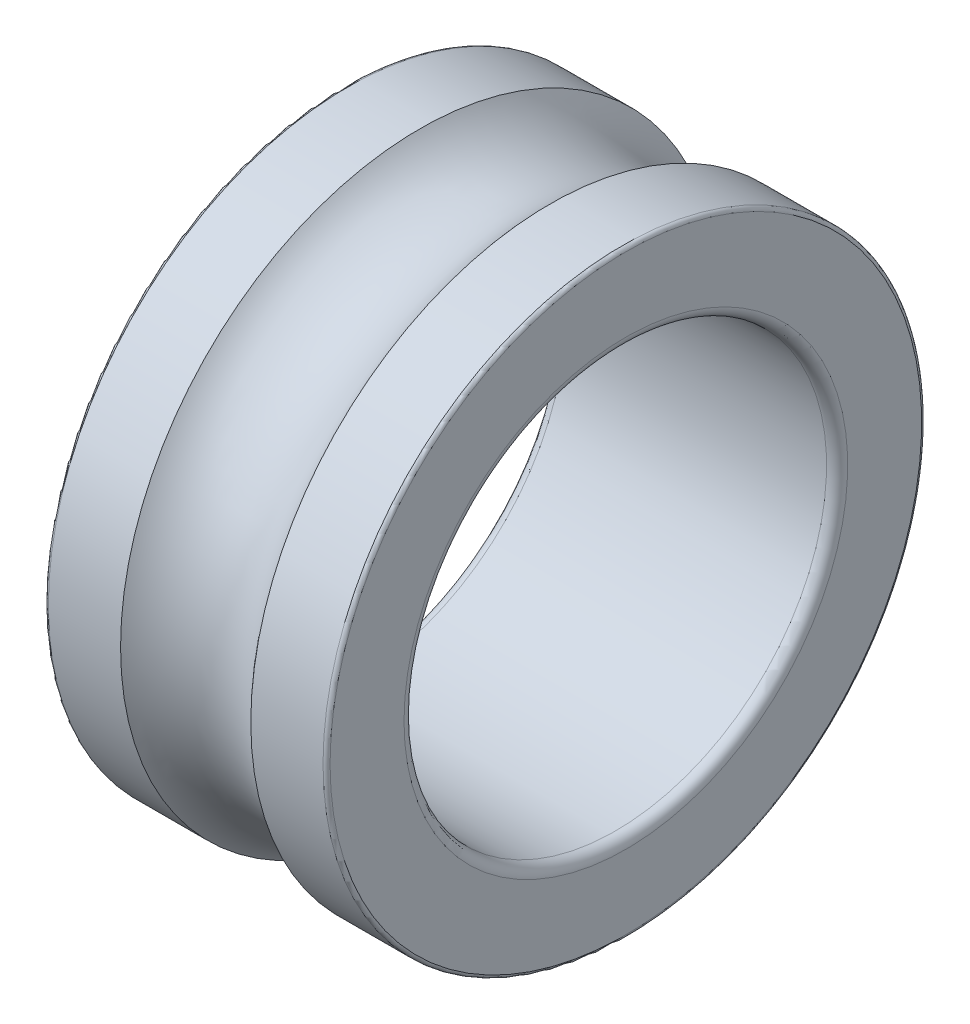
ISO-10303-21;
HEADER;
FILE_DESCRIPTION(('STEP AP214'),'2;1');
FILE_NAME('part.step','',(''),(''),'','','');
FILE_SCHEMA(('AUTOMOTIVE_DESIGN { 1 0 10303 214 1 1 1 1 }'));
ENDSEC;
DATA;
#1=APPLICATION_CONTEXT('core data for automotive mechanical design processes');
#2=APPLICATION_PROTOCOL_DEFINITION('international standard','automotive_design',2000,#1);
#3=PRODUCT_CONTEXT('',#1,'mechanical');
#4=PRODUCT('Part','Part','',(#3));
#5=PRODUCT_RELATED_PRODUCT_CATEGORY('part','',(#4));
#6=PRODUCT_DEFINITION_FORMATION('','',#4);
#7=PRODUCT_DEFINITION_CONTEXT('part definition',#1,'design');
#8=PRODUCT_DEFINITION('design','',#6,#7);
#9=PRODUCT_DEFINITION_SHAPE('','',#8);
#10=(LENGTH_UNIT() NAMED_UNIT(*) SI_UNIT(.MILLI.,.METRE.));
#11=(NAMED_UNIT(*) PLANE_ANGLE_UNIT() SI_UNIT($,.RADIAN.));
#12=(NAMED_UNIT(*) SI_UNIT($,.STERADIAN.) SOLID_ANGLE_UNIT());
#13=UNCERTAINTY_MEASURE_WITH_UNIT(LENGTH_MEASURE(1.E-05),#10,'distance_accuracy_value','');
#14=(GEOMETRIC_REPRESENTATION_CONTEXT(3) GLOBAL_UNCERTAINTY_ASSIGNED_CONTEXT((#13)) GLOBAL_UNIT_ASSIGNED_CONTEXT((#10,
#11,#12)) REPRESENTATION_CONTEXT('',''));
#15=CARTESIAN_POINT('',(0.,0.,0.));
#16=DIRECTION('',(0.,0.,1.));
#17=DIRECTION('',(1.,0.,0.));
#18=AXIS2_PLACEMENT_3D('',#15,#16,#17);
#19=CARTESIAN_POINT('',(0.299999999999939,0.,0.));
#20=DIRECTION('',(-1.,0.,0.));
#21=DIRECTION('',(0.,0.,1.));
#22=AXIS2_PLACEMENT_3D('',#19,#20,#21);
#23=TOROIDAL_SURFACE('',#22,6.29999999999994,0.299999999999939);
#24=CARTESIAN_POINT('',(0.299999999999995,0.,0.));
#25=DIRECTION('',(-1.,0.,0.));
#26=DIRECTION('',(0.,0.,1.));
#27=AXIS2_PLACEMENT_3D('',#24,#25,#26);
#28=CIRCLE('',#27,6.);
#29=CARTESIAN_POINT('',(0.299999999999995,0.,6.));
#30=VERTEX_POINT('',#29);
#31=EDGE_CURVE('E10',#30,#30,#28,.T.);
#32=ORIENTED_EDGE('',*,*,#31,.F.);
#33=EDGE_LOOP('',(#32));
#34=FACE_BOUND('',#33,.T.);
#35=CARTESIAN_POINT('',(0.,0.,0.));
#36=DIRECTION('',(-1.,0.,0.));
#37=DIRECTION('',(0.,0.,1.));
#38=AXIS2_PLACEMENT_3D('',#35,#36,#37);
#39=CIRCLE('',#38,6.3);
#40=CARTESIAN_POINT('',(0.,0.,6.3));
#41=VERTEX_POINT('',#40);
#42=EDGE_CURVE('E65',#41,#41,#39,.T.);
#43=ORIENTED_EDGE('',*,*,#42,.T.);
#44=EDGE_LOOP('',(#43));
#45=FACE_BOUND('',#44,.T.);
#46=ADVANCED_FACE('F31',(#34,#45),#23,.T.);
#47=CARTESIAN_POINT('',(100.,0.,0.));
#48=DIRECTION('',(-1.,0.,0.));
#49=DIRECTION('',(0.,0.,1.));
#50=AXIS2_PLACEMENT_3D('',#47,#48,#49);
#51=CYLINDRICAL_SURFACE('',#50,6.);
#52=CARTESIAN_POINT('',(7.7,0.,0.));
#53=DIRECTION('',(-1.,0.,0.));
#54=DIRECTION('',(0.,0.,1.));
#55=AXIS2_PLACEMENT_3D('',#52,#53,#54);
#56=CIRCLE('',#55,6.);
#57=CARTESIAN_POINT('',(7.7,0.,6.));
#58=VERTEX_POINT('',#57);
#59=EDGE_CURVE('E37',#58,#58,#56,.T.);
#60=ORIENTED_EDGE('',*,*,#59,.F.);
#61=EDGE_LOOP('',(#60));
#62=FACE_BOUND('',#61,.T.);
#63=ORIENTED_EDGE('',*,*,#31,.T.);
#64=EDGE_LOOP('',(#63));
#65=FACE_BOUND('',#64,.T.);
#66=ADVANCED_FACE('F114',(#62,#65),#51,.F.);
#67=CARTESIAN_POINT('',(7.70000000000012,0.,0.));
#68=DIRECTION('',(-1.,0.,0.));
#69=DIRECTION('',(0.,0.,1.));
#70=AXIS2_PLACEMENT_3D('',#67,#68,#69);
#71=TOROIDAL_SURFACE('',#70,6.29999999999988,0.299999999999878);
#72=CARTESIAN_POINT('',(8.00000000000001,0.,0.));
#73=DIRECTION('',(-1.,0.,0.));
#74=DIRECTION('',(0.,0.,1.));
#75=AXIS2_PLACEMENT_3D('',#72,#73,#74);
#76=CIRCLE('',#75,6.3);
#77=CARTESIAN_POINT('',(8.00000000000001,0.,6.3));
#78=VERTEX_POINT('',#77);
#79=EDGE_CURVE('E41',#78,#78,#76,.T.);
#80=ORIENTED_EDGE('',*,*,#79,.F.);
#81=EDGE_LOOP('',(#80));
#82=FACE_BOUND('',#81,.T.);
#83=ORIENTED_EDGE('',*,*,#59,.T.);
#84=EDGE_LOOP('',(#83));
#85=FACE_BOUND('',#84,.T.);
#86=ADVANCED_FACE('F109',(#82,#85),#71,.T.);
#87=CARTESIAN_POINT('',(8.,6.3,0.));
#88=DIRECTION('',(-1.,0.,0.));
#89=DIRECTION('',(0.,0.,1.));
#90=AXIS2_PLACEMENT_3D('',#87,#88,#89);
#91=PLANE('',#90);
#92=CARTESIAN_POINT('',(8.00000000000001,0.,0.));
#93=DIRECTION('',(-1.,0.,0.));
#94=DIRECTION('',(0.,0.,1.));
#95=AXIS2_PLACEMENT_3D('',#92,#93,#94);
#96=CIRCLE('',#95,8.4);
#97=CARTESIAN_POINT('',(8.00000000000001,0.,8.4));
#98=VERTEX_POINT('',#97);
#99=EDGE_CURVE('E45',#98,#98,#96,.T.);
#100=ORIENTED_EDGE('',*,*,#99,.F.);
#101=EDGE_LOOP('',(#100));
#102=FACE_BOUND('',#101,.T.);
#103=ORIENTED_EDGE('',*,*,#79,.T.);
#104=EDGE_LOOP('',(#103));
#105=FACE_BOUND('',#104,.T.);
#106=ADVANCED_FACE('F103',(#102,#105),#91,.F.);
#107=CARTESIAN_POINT('',(7.90000000000015,0.,0.));
#108=DIRECTION('',(-1.,0.,0.));
#109=DIRECTION('',(0.,0.,1.));
#110=AXIS2_PLACEMENT_3D('',#107,#108,#109);
#111=TOROIDAL_SURFACE('',#110,8.40000000000015,0.0999999999998459);
#112=CARTESIAN_POINT('',(7.9,0.,0.));
#113=DIRECTION('',(-1.,0.,0.));
#114=DIRECTION('',(0.,0.,1.));
#115=AXIS2_PLACEMENT_3D('',#112,#113,#114);
#116=CIRCLE('',#115,8.5);
#117=CARTESIAN_POINT('',(7.9,0.,8.5));
#118=VERTEX_POINT('',#117);
#119=EDGE_CURVE('E50',#118,#118,#116,.T.);
#120=ORIENTED_EDGE('',*,*,#119,.F.);
#121=EDGE_LOOP('',(#120));
#122=FACE_BOUND('',#121,.T.);
#123=ORIENTED_EDGE('',*,*,#99,.T.);
#124=EDGE_LOOP('',(#123));
#125=FACE_BOUND('',#124,.T.);
#126=ADVANCED_FACE('F97',(#122,#125),#111,.T.);
#127=CARTESIAN_POINT('',(100.,0.,0.));
#128=DIRECTION('',(-1.,0.,0.));
#129=DIRECTION('',(0.,0.,1.));
#130=AXIS2_PLACEMENT_3D('',#127,#128,#129);
#131=CYLINDRICAL_SURFACE('',#130,8.5);
#132=CARTESIAN_POINT('',(5.84909734735629,0.,0.));
#133=DIRECTION('',(-1.,0.,0.));
#134=DIRECTION('',(0.,0.,1.));
#135=AXIS2_PLACEMENT_3D('',#132,#133,#134);
#136=CIRCLE('',#135,8.5);
#137=CARTESIAN_POINT('',(5.84909734735629,0.,8.5));
#138=VERTEX_POINT('',#137);
#139=EDGE_CURVE('E53',#138,#138,#136,.T.);
#140=ORIENTED_EDGE('',*,*,#139,.F.);
#141=EDGE_LOOP('',(#140));
#142=FACE_BOUND('',#141,.T.);
#143=ORIENTED_EDGE('',*,*,#119,.T.);
#144=EDGE_LOOP('',(#143));
#145=FACE_BOUND('',#144,.T.);
#146=ADVANCED_FACE('F91',(#142,#145),#131,.T.);
#147=CARTESIAN_POINT('',(4.,0.,0.));
#148=DIRECTION('',(-1.,0.,0.));
#149=DIRECTION('',(0.,0.,1.));
#150=AXIS2_PLACEMENT_3D('',#147,#148,#149);
#151=TOROIDAL_SURFACE('',#150,10.0000000000001,2.38100000000006);
#152=CARTESIAN_POINT('',(2.1509026526437,0.,0.));
#153=DIRECTION('',(-1.,0.,0.));
#154=DIRECTION('',(0.,0.,1.));
#155=AXIS2_PLACEMENT_3D('',#152,#153,#154);
#156=CIRCLE('',#155,8.5);
#157=CARTESIAN_POINT('',(2.1509026526437,0.,8.5));
#158=VERTEX_POINT('',#157);
#159=EDGE_CURVE('E56',#158,#158,#156,.T.);
#160=ORIENTED_EDGE('',*,*,#159,.F.);
#161=EDGE_LOOP('',(#160));
#162=FACE_BOUND('',#161,.T.);
#163=ORIENTED_EDGE('',*,*,#139,.T.);
#164=EDGE_LOOP('',(#163));
#165=FACE_BOUND('',#164,.T.);
#166=ADVANCED_FACE('F85',(#162,#165),#151,.F.);
#167=CARTESIAN_POINT('',(100.,0.,0.));
#168=DIRECTION('',(-1.,0.,0.));
#169=DIRECTION('',(0.,0.,1.));
#170=AXIS2_PLACEMENT_3D('',#167,#168,#169);
#171=CYLINDRICAL_SURFACE('',#170,8.5);
#172=CARTESIAN_POINT('',(0.100000000000003,0.,0.));
#173=DIRECTION('',(-1.,0.,0.));
#174=DIRECTION('',(0.,0.,1.));
#175=AXIS2_PLACEMENT_3D('',#172,#173,#174);
#176=CIRCLE('',#175,8.5);
#177=CARTESIAN_POINT('',(0.100000000000003,0.,8.5));
#178=VERTEX_POINT('',#177);
#179=EDGE_CURVE('E59',#178,#178,#176,.T.);
#180=ORIENTED_EDGE('',*,*,#179,.F.);
#181=EDGE_LOOP('',(#180));
#182=FACE_BOUND('',#181,.T.);
#183=ORIENTED_EDGE('',*,*,#159,.T.);
#184=EDGE_LOOP('',(#183));
#185=FACE_BOUND('',#184,.T.);
#186=ADVANCED_FACE('F79',(#182,#185),#171,.T.);
#187=CARTESIAN_POINT('',(0.0999999999999248,0.,0.));
#188=DIRECTION('',(-1.,0.,0.));
#189=DIRECTION('',(0.,0.,1.));
#190=AXIS2_PLACEMENT_3D('',#187,#188,#189);
#191=TOROIDAL_SURFACE('',#190,8.40000000000007,0.0999999999999248);
#192=CARTESIAN_POINT('',(0.,0.,0.));
#193=DIRECTION('',(-1.,0.,0.));
#194=DIRECTION('',(0.,0.,1.));
#195=AXIS2_PLACEMENT_3D('',#192,#193,#194);
#196=CIRCLE('',#195,8.4);
#197=CARTESIAN_POINT('',(0.,0.,8.4));
#198=VERTEX_POINT('',#197);
#199=EDGE_CURVE('E62',#198,#198,#196,.T.);
#200=ORIENTED_EDGE('',*,*,#199,.F.);
#201=EDGE_LOOP('',(#200));
#202=FACE_BOUND('',#201,.T.);
#203=ORIENTED_EDGE('',*,*,#179,.T.);
#204=EDGE_LOOP('',(#203));
#205=FACE_BOUND('',#204,.T.);
#206=ADVANCED_FACE('F73',(#202,#205),#191,.T.);
#207=CARTESIAN_POINT('',(0.,8.4,0.));
#208=DIRECTION('',(1.,0.,0.));
#209=DIRECTION('',(0.,0.,-1.));
#210=AXIS2_PLACEMENT_3D('',#207,#208,#209);
#211=PLANE('',#210);
#212=ORIENTED_EDGE('',*,*,#42,.F.);
#213=EDGE_LOOP('',(#212));
#214=FACE_BOUND('',#213,.T.);
#215=ORIENTED_EDGE('',*,*,#199,.T.);
#216=EDGE_LOOP('',(#215));
#217=FACE_BOUND('',#216,.T.);
#218=ADVANCED_FACE('F70',(#214,#217),#211,.F.);
#219=CLOSED_SHELL('',(#46,#66,#86,#106,#126,#146,#166,#186,#206,#218));
#220=MANIFOLD_SOLID_BREP('B2',#219);
#221=ADVANCED_BREP_SHAPE_REPRESENTATION('',(#18,#220),#14);
#222=SHAPE_DEFINITION_REPRESENTATION(#9,#221);
ENDSEC;
END-ISO-10303-21;
